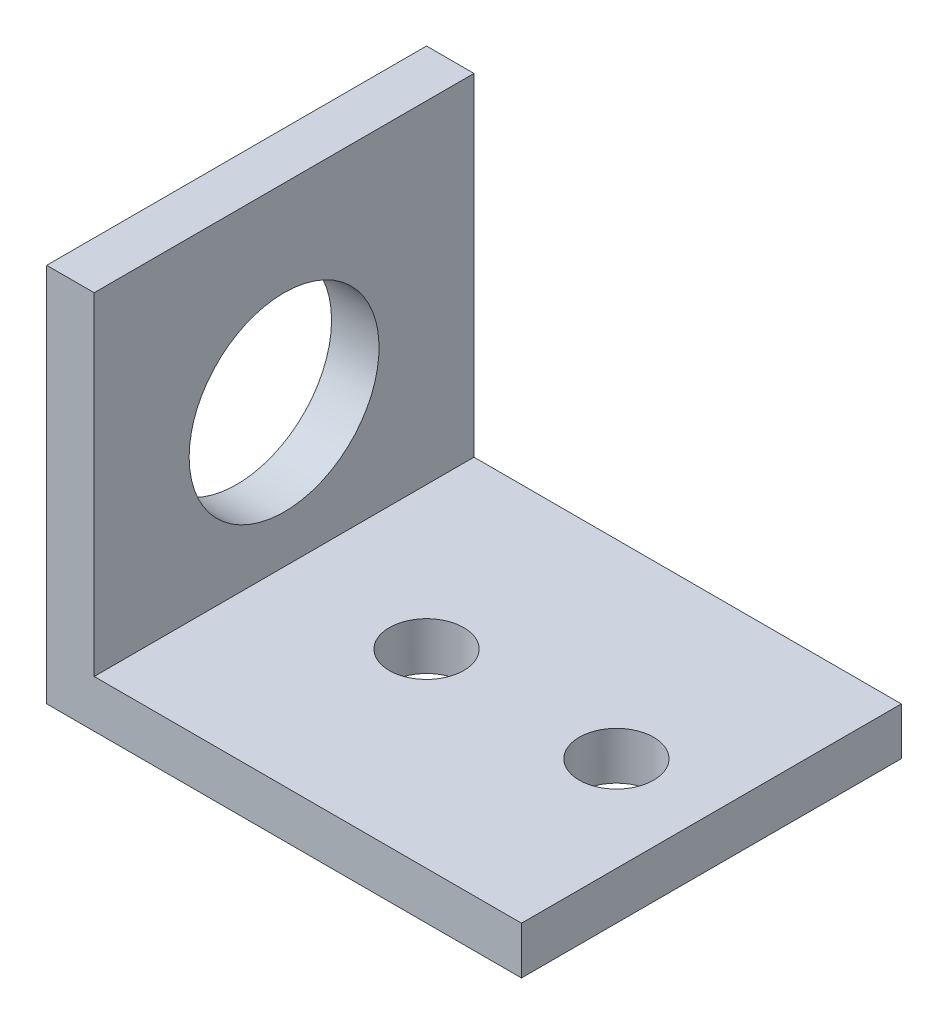
ISO-10303-21;
HEADER;
FILE_DESCRIPTION(('STEP AP214'),'2;1');
FILE_NAME('part.step','',(''),(''),'','','');
FILE_SCHEMA(('AUTOMOTIVE_DESIGN { 1 0 10303 214 1 1 1 1 }'));
ENDSEC;
DATA;
#1=APPLICATION_CONTEXT('core data for automotive mechanical design processes');
#2=APPLICATION_PROTOCOL_DEFINITION('international standard','automotive_design',2000,#1);
#3=PRODUCT_CONTEXT('',#1,'mechanical');
#4=PRODUCT('Part','Part','',(#3));
#5=PRODUCT_RELATED_PRODUCT_CATEGORY('part','',(#4));
#6=PRODUCT_DEFINITION_FORMATION('','',#4);
#7=PRODUCT_DEFINITION_CONTEXT('part definition',#1,'design');
#8=PRODUCT_DEFINITION('design','',#6,#7);
#9=PRODUCT_DEFINITION_SHAPE('','',#8);
#10=(LENGTH_UNIT() NAMED_UNIT(*) SI_UNIT(.MILLI.,.METRE.));
#11=(NAMED_UNIT(*) PLANE_ANGLE_UNIT() SI_UNIT($,.RADIAN.));
#12=(NAMED_UNIT(*) SI_UNIT($,.STERADIAN.) SOLID_ANGLE_UNIT());
#13=UNCERTAINTY_MEASURE_WITH_UNIT(LENGTH_MEASURE(1.E-05),#10,'distance_accuracy_value','');
#14=(GEOMETRIC_REPRESENTATION_CONTEXT(3) GLOBAL_UNCERTAINTY_ASSIGNED_CONTEXT((#13)) GLOBAL_UNIT_ASSIGNED_CONTEXT((#10,
#11,#12)) REPRESENTATION_CONTEXT('',''));
#15=CARTESIAN_POINT('',(0.,0.,0.));
#16=DIRECTION('',(0.,0.,1.));
#17=DIRECTION('',(1.,0.,0.));
#18=AXIS2_PLACEMENT_3D('',#15,#16,#17);
#19=CARTESIAN_POINT('',(0.,25.4,25.4));
#20=DIRECTION('',(0.,1.,0.));
#21=DIRECTION('',(0.,0.,1.));
#22=AXIS2_PLACEMENT_3D('',#19,#20,#21);
#23=PLANE('',#22);
#24=DIRECTION('',(1.,0.,0.));
#25=VECTOR('',#24,1.);
#26=CARTESIAN_POINT('',(0.,25.4,0.));
#27=LINE('',#26,#25);
#28=CARTESIAN_POINT('',(0.,25.4,0.));
#29=VERTEX_POINT('',#28);
#30=CARTESIAN_POINT('',(3.175,25.4,0.));
#31=VERTEX_POINT('',#30);
#32=EDGE_CURVE('E119',#29,#31,#27,.T.);
#33=ORIENTED_EDGE('',*,*,#32,.F.);
#34=DIRECTION('',(0.,0.,-1.));
#35=VECTOR('',#34,1.);
#36=CARTESIAN_POINT('',(0.,25.4,25.4));
#37=LINE('',#36,#35);
#38=CARTESIAN_POINT('',(0.,25.4,25.4));
#39=VERTEX_POINT('',#38);
#40=EDGE_CURVE('E11',#39,#29,#37,.T.);
#41=ORIENTED_EDGE('',*,*,#40,.F.);
#42=DIRECTION('',(1.,0.,0.));
#43=VECTOR('',#42,1.);
#44=CARTESIAN_POINT('',(0.,25.4,25.4));
#45=LINE('',#44,#43);
#46=CARTESIAN_POINT('',(3.175,25.4,25.4));
#47=VERTEX_POINT('',#46);
#48=EDGE_CURVE('E134',#39,#47,#45,.T.);
#49=ORIENTED_EDGE('',*,*,#48,.T.);
#50=DIRECTION('',(0.,0.,-1.));
#51=VECTOR('',#50,1.);
#52=CARTESIAN_POINT('',(3.175,25.4,25.4));
#53=LINE('',#52,#51);
#54=EDGE_CURVE('E83',#47,#31,#53,.T.);
#55=ORIENTED_EDGE('',*,*,#54,.T.);
#56=EDGE_LOOP('',(#33,#41,#49,#55));
#57=FACE_BOUND('',#56,.T.);
#58=ADVANCED_FACE('F33',(#57),#23,.T.);
#59=CARTESIAN_POINT('',(0.,0.,25.4));
#60=DIRECTION('',(-1.,0.,0.));
#61=DIRECTION('',(0.,0.,1.));
#62=AXIS2_PLACEMENT_3D('',#59,#60,#61);
#63=PLANE('',#62);
#64=CARTESIAN_POINT('',(0.,12.7,12.7));
#65=DIRECTION('',(-1.,0.,0.));
#66=DIRECTION('',(0.,0.,1.));
#67=AXIS2_PLACEMENT_3D('',#64,#65,#66);
#68=CIRCLE('',#67,6.35);
#69=CARTESIAN_POINT('',(0.,12.7,19.05));
#70=VERTEX_POINT('',#69);
#71=EDGE_CURVE('E142',#70,#70,#68,.T.);
#72=ORIENTED_EDGE('',*,*,#71,.F.);
#73=EDGE_LOOP('',(#72));
#74=FACE_BOUND('',#73,.T.);
#75=DIRECTION('',(0.,1.,0.));
#76=VECTOR('',#75,1.);
#77=CARTESIAN_POINT('',(0.,0.,0.));
#78=LINE('',#77,#76);
#79=CARTESIAN_POINT('',(0.,0.,0.));
#80=VERTEX_POINT('',#79);
#81=EDGE_CURVE('E132',#80,#29,#78,.T.);
#82=ORIENTED_EDGE('',*,*,#81,.F.);
#83=DIRECTION('',(0.,0.,-1.));
#84=VECTOR('',#83,1.);
#85=CARTESIAN_POINT('',(0.,0.,25.4));
#86=LINE('',#85,#84);
#87=CARTESIAN_POINT('',(0.,0.,25.4));
#88=VERTEX_POINT('',#87);
#89=EDGE_CURVE('E42',#88,#80,#86,.T.);
#90=ORIENTED_EDGE('',*,*,#89,.F.);
#91=DIRECTION('',(0.,1.,0.));
#92=VECTOR('',#91,1.);
#93=CARTESIAN_POINT('',(0.,0.,25.4));
#94=LINE('',#93,#92);
#95=EDGE_CURVE('E109',#88,#39,#94,.T.);
#96=ORIENTED_EDGE('',*,*,#95,.T.);
#97=ORIENTED_EDGE('',*,*,#40,.T.);
#98=EDGE_LOOP('',(#82,#90,#96,#97));
#99=FACE_BOUND('',#98,.T.);
#100=ADVANCED_FACE('F163',(#74,#99),#63,.T.);
#101=CARTESIAN_POINT('',(31.75,0.,25.4));
#102=DIRECTION('',(0.,-1.,0.));
#103=DIRECTION('',(1.,0.,0.));
#104=AXIS2_PLACEMENT_3D('',#101,#102,#103);
#105=PLANE('',#104);
#106=CARTESIAN_POINT('',(12.7,0.,12.7));
#107=DIRECTION('',(0.,-1.,0.));
#108=DIRECTION('',(1.,0.,0.));
#109=AXIS2_PLACEMENT_3D('',#106,#107,#108);
#110=CIRCLE('',#109,2.4892);
#111=CARTESIAN_POINT('',(15.1892,0.,12.7));
#112=VERTEX_POINT('',#111);
#113=EDGE_CURVE('E145',#112,#112,#110,.T.);
#114=ORIENTED_EDGE('',*,*,#113,.F.);
#115=EDGE_LOOP('',(#114));
#116=FACE_BOUND('',#115,.T.);
#117=CARTESIAN_POINT('',(25.4,0.,12.7));
#118=DIRECTION('',(0.,-1.,0.));
#119=DIRECTION('',(1.,0.,0.));
#120=AXIS2_PLACEMENT_3D('',#117,#118,#119);
#121=CIRCLE('',#120,2.4892);
#122=CARTESIAN_POINT('',(27.8892,0.,12.7));
#123=VERTEX_POINT('',#122);
#124=EDGE_CURVE('E150',#123,#123,#121,.T.);
#125=ORIENTED_EDGE('',*,*,#124,.F.);
#126=EDGE_LOOP('',(#125));
#127=FACE_BOUND('',#126,.T.);
#128=DIRECTION('',(-1.,0.,0.));
#129=VECTOR('',#128,1.);
#130=CARTESIAN_POINT('',(31.75,0.,0.));
#131=LINE('',#130,#129);
#132=CARTESIAN_POINT('',(31.75,0.,0.));
#133=VERTEX_POINT('',#132);
#134=EDGE_CURVE('E96',#133,#80,#131,.T.);
#135=ORIENTED_EDGE('',*,*,#134,.F.);
#136=DIRECTION('',(0.,0.,-1.));
#137=VECTOR('',#136,1.);
#138=CARTESIAN_POINT('',(31.75,0.,25.4));
#139=LINE('',#138,#137);
#140=CARTESIAN_POINT('',(31.75,0.,25.4));
#141=VERTEX_POINT('',#140);
#142=EDGE_CURVE('E91',#141,#133,#139,.T.);
#143=ORIENTED_EDGE('',*,*,#142,.F.);
#144=DIRECTION('',(-1.,0.,0.));
#145=VECTOR('',#144,1.);
#146=CARTESIAN_POINT('',(31.75,0.,25.4));
#147=LINE('',#146,#145);
#148=EDGE_CURVE('E94',#141,#88,#147,.T.);
#149=ORIENTED_EDGE('',*,*,#148,.T.);
#150=ORIENTED_EDGE('',*,*,#89,.T.);
#151=EDGE_LOOP('',(#135,#143,#149,#150));
#152=FACE_BOUND('',#151,.T.);
#153=ADVANCED_FACE('F93',(#116,#127,#152),#105,.T.);
#154=CARTESIAN_POINT('',(31.75,3.175,25.4));
#155=DIRECTION('',(1.,0.,0.));
#156=DIRECTION('',(0.,0.,-1.));
#157=AXIS2_PLACEMENT_3D('',#154,#155,#156);
#158=PLANE('',#157);
#159=DIRECTION('',(0.,-1.,0.));
#160=VECTOR('',#159,1.);
#161=CARTESIAN_POINT('',(31.75,3.175,0.));
#162=LINE('',#161,#160);
#163=CARTESIAN_POINT('',(31.75,3.175,0.));
#164=VERTEX_POINT('',#163);
#165=EDGE_CURVE('E129',#164,#133,#162,.T.);
#166=ORIENTED_EDGE('',*,*,#165,.F.);
#167=DIRECTION('',(0.,0.,-1.));
#168=VECTOR('',#167,1.);
#169=CARTESIAN_POINT('',(31.75,3.175,25.4));
#170=LINE('',#169,#168);
#171=CARTESIAN_POINT('',(31.75,3.175,25.4));
#172=VERTEX_POINT('',#171);
#173=EDGE_CURVE('E101',#172,#164,#170,.T.);
#174=ORIENTED_EDGE('',*,*,#173,.F.);
#175=DIRECTION('',(0.,-1.,0.));
#176=VECTOR('',#175,1.);
#177=CARTESIAN_POINT('',(31.75,3.175,25.4));
#178=LINE('',#177,#176);
#179=EDGE_CURVE('E107',#172,#141,#178,.T.);
#180=ORIENTED_EDGE('',*,*,#179,.T.);
#181=ORIENTED_EDGE('',*,*,#142,.T.);
#182=EDGE_LOOP('',(#166,#174,#180,#181));
#183=FACE_BOUND('',#182,.T.);
#184=ADVANCED_FACE('F111',(#183),#158,.T.);
#185=CARTESIAN_POINT('',(3.175,3.175,25.4));
#186=DIRECTION('',(0.,1.,0.));
#187=DIRECTION('',(-1.,0.,0.));
#188=AXIS2_PLACEMENT_3D('',#185,#186,#187);
#189=PLANE('',#188);
#190=CARTESIAN_POINT('',(12.7,3.175,12.7));
#191=DIRECTION('',(0.,1.,0.));
#192=DIRECTION('',(-1.,0.,0.));
#193=AXIS2_PLACEMENT_3D('',#190,#191,#192);
#194=CIRCLE('',#193,2.4892);
#195=CARTESIAN_POINT('',(10.2108,3.175,12.7));
#196=VERTEX_POINT('',#195);
#197=EDGE_CURVE('E36',#196,#196,#194,.T.);
#198=ORIENTED_EDGE('',*,*,#197,.F.);
#199=EDGE_LOOP('',(#198));
#200=FACE_BOUND('',#199,.T.);
#201=CARTESIAN_POINT('',(25.4,3.175,12.7));
#202=DIRECTION('',(0.,1.,0.));
#203=DIRECTION('',(-1.,0.,0.));
#204=AXIS2_PLACEMENT_3D('',#201,#202,#203);
#205=CIRCLE('',#204,2.4892);
#206=CARTESIAN_POINT('',(22.9108,3.175,12.7));
#207=VERTEX_POINT('',#206);
#208=EDGE_CURVE('E143',#207,#207,#205,.T.);
#209=ORIENTED_EDGE('',*,*,#208,.F.);
#210=EDGE_LOOP('',(#209));
#211=FACE_BOUND('',#210,.T.);
#212=DIRECTION('',(1.,0.,0.));
#213=VECTOR('',#212,1.);
#214=CARTESIAN_POINT('',(3.175,3.175,0.));
#215=LINE('',#214,#213);
#216=CARTESIAN_POINT('',(3.175,3.175,0.));
#217=VERTEX_POINT('',#216);
#218=EDGE_CURVE('E126',#217,#164,#215,.T.);
#219=ORIENTED_EDGE('',*,*,#218,.F.);
#220=DIRECTION('',(0.,0.,-1.));
#221=VECTOR('',#220,1.);
#222=CARTESIAN_POINT('',(3.175,3.175,25.4));
#223=LINE('',#222,#221);
#224=CARTESIAN_POINT('',(3.175,3.175,25.4));
#225=VERTEX_POINT('',#224);
#226=EDGE_CURVE('E138',#225,#217,#223,.T.);
#227=ORIENTED_EDGE('',*,*,#226,.F.);
#228=DIRECTION('',(1.,0.,0.));
#229=VECTOR('',#228,1.);
#230=CARTESIAN_POINT('',(3.175,3.175,25.4));
#231=LINE('',#230,#229);
#232=EDGE_CURVE('E112',#225,#172,#231,.T.);
#233=ORIENTED_EDGE('',*,*,#232,.T.);
#234=ORIENTED_EDGE('',*,*,#173,.T.);
#235=EDGE_LOOP('',(#219,#227,#233,#234));
#236=FACE_BOUND('',#235,.T.);
#237=ADVANCED_FACE('F179',(#200,#211,#236),#189,.T.);
#238=CARTESIAN_POINT('',(3.175,25.4,25.4));
#239=DIRECTION('',(1.,0.,0.));
#240=DIRECTION('',(0.,1.,0.));
#241=AXIS2_PLACEMENT_3D('',#238,#239,#240);
#242=PLANE('',#241);
#243=CARTESIAN_POINT('',(3.175,12.7,12.7));
#244=DIRECTION('',(1.,0.,0.));
#245=DIRECTION('',(0.,1.,0.));
#246=AXIS2_PLACEMENT_3D('',#243,#244,#245);
#247=CIRCLE('',#246,6.35);
#248=CARTESIAN_POINT('',(3.175,19.05,12.7));
#249=VERTEX_POINT('',#248);
#250=EDGE_CURVE('E123',#249,#249,#247,.T.);
#251=ORIENTED_EDGE('',*,*,#250,.F.);
#252=EDGE_LOOP('',(#251));
#253=FACE_BOUND('',#252,.T.);
#254=DIRECTION('',(0.,-1.,0.));
#255=VECTOR('',#254,1.);
#256=CARTESIAN_POINT('',(3.175,25.4,0.));
#257=LINE('',#256,#255);
#258=EDGE_CURVE('E122',#31,#217,#257,.T.);
#259=ORIENTED_EDGE('',*,*,#258,.F.);
#260=ORIENTED_EDGE('',*,*,#54,.F.);
#261=DIRECTION('',(0.,-1.,0.));
#262=VECTOR('',#261,1.);
#263=CARTESIAN_POINT('',(3.175,25.4,25.4));
#264=LINE('',#263,#262);
#265=EDGE_CURVE('E114',#47,#225,#264,.T.);
#266=ORIENTED_EDGE('',*,*,#265,.T.);
#267=ORIENTED_EDGE('',*,*,#226,.T.);
#268=EDGE_LOOP('',(#259,#260,#266,#267));
#269=FACE_BOUND('',#268,.T.);
#270=ADVANCED_FACE('F159',(#253,#269),#242,.T.);
#271=CARTESIAN_POINT('',(0.,0.,25.4));
#272=DIRECTION('',(0.,0.,-1.));
#273=DIRECTION('',(-1.,0.,0.));
#274=AXIS2_PLACEMENT_3D('',#271,#272,#273);
#275=PLANE('',#274);
#276=ORIENTED_EDGE('',*,*,#48,.F.);
#277=ORIENTED_EDGE('',*,*,#95,.F.);
#278=ORIENTED_EDGE('',*,*,#148,.F.);
#279=ORIENTED_EDGE('',*,*,#179,.F.);
#280=ORIENTED_EDGE('',*,*,#232,.F.);
#281=ORIENTED_EDGE('',*,*,#265,.F.);
#282=EDGE_LOOP('',(#276,#277,#278,#279,#280,#281));
#283=FACE_BOUND('',#282,.T.);
#284=ADVANCED_FACE('F105',(#283),#275,.F.);
#285=CARTESIAN_POINT('',(0.,0.,0.));
#286=DIRECTION('',(0.,0.,-1.));
#287=DIRECTION('',(-1.,0.,0.));
#288=AXIS2_PLACEMENT_3D('',#285,#286,#287);
#289=PLANE('',#288);
#290=ORIENTED_EDGE('',*,*,#32,.T.);
#291=ORIENTED_EDGE('',*,*,#258,.T.);
#292=ORIENTED_EDGE('',*,*,#218,.T.);
#293=ORIENTED_EDGE('',*,*,#165,.T.);
#294=ORIENTED_EDGE('',*,*,#134,.T.);
#295=ORIENTED_EDGE('',*,*,#81,.T.);
#296=EDGE_LOOP('',(#290,#291,#292,#293,#294,#295));
#297=FACE_BOUND('',#296,.T.);
#298=ADVANCED_FACE('F162',(#297),#289,.T.);
#299=CARTESIAN_POINT('',(31.75,12.7,12.7));
#300=DIRECTION('',(-1.,0.,0.));
#301=DIRECTION('',(0.,0.,1.));
#302=AXIS2_PLACEMENT_3D('',#299,#300,#301);
#303=CYLINDRICAL_SURFACE('',#302,6.35);
#304=ORIENTED_EDGE('',*,*,#250,.T.);
#305=EDGE_LOOP('',(#304));
#306=FACE_BOUND('',#305,.T.);
#307=ORIENTED_EDGE('',*,*,#71,.T.);
#308=EDGE_LOOP('',(#307));
#309=FACE_BOUND('',#308,.T.);
#310=ADVANCED_FACE('F189',(#306,#309),#303,.F.);
#311=CARTESIAN_POINT('',(25.4,25.4,12.7));
#312=DIRECTION('',(0.,-1.,0.));
#313=DIRECTION('',(1.,0.,0.));
#314=AXIS2_PLACEMENT_3D('',#311,#312,#313);
#315=CYLINDRICAL_SURFACE('',#314,2.4892);
#316=ORIENTED_EDGE('',*,*,#208,.T.);
#317=EDGE_LOOP('',(#316));
#318=FACE_BOUND('',#317,.T.);
#319=ORIENTED_EDGE('',*,*,#124,.T.);
#320=EDGE_LOOP('',(#319));
#321=FACE_BOUND('',#320,.T.);
#322=ADVANCED_FACE('F192',(#318,#321),#315,.F.);
#323=CARTESIAN_POINT('',(12.7,25.4,12.7));
#324=DIRECTION('',(0.,-1.,0.));
#325=DIRECTION('',(1.,0.,0.));
#326=AXIS2_PLACEMENT_3D('',#323,#324,#325);
#327=CYLINDRICAL_SURFACE('',#326,2.4892);
#328=ORIENTED_EDGE('',*,*,#197,.T.);
#329=EDGE_LOOP('',(#328));
#330=FACE_BOUND('',#329,.T.);
#331=ORIENTED_EDGE('',*,*,#113,.T.);
#332=EDGE_LOOP('',(#331));
#333=FACE_BOUND('',#332,.T.);
#334=ADVANCED_FACE('F198',(#330,#333),#327,.F.);
#335=CLOSED_SHELL('',(#58,#100,#153,#184,#237,#270,#284,#298,#310,#322,#334));
#336=MANIFOLD_SOLID_BREP('B2',#335);
#337=ADVANCED_BREP_SHAPE_REPRESENTATION('',(#18,#336),#14);
#338=SHAPE_DEFINITION_REPRESENTATION(#9,#337);
ENDSEC;
END-ISO-10303-21;
